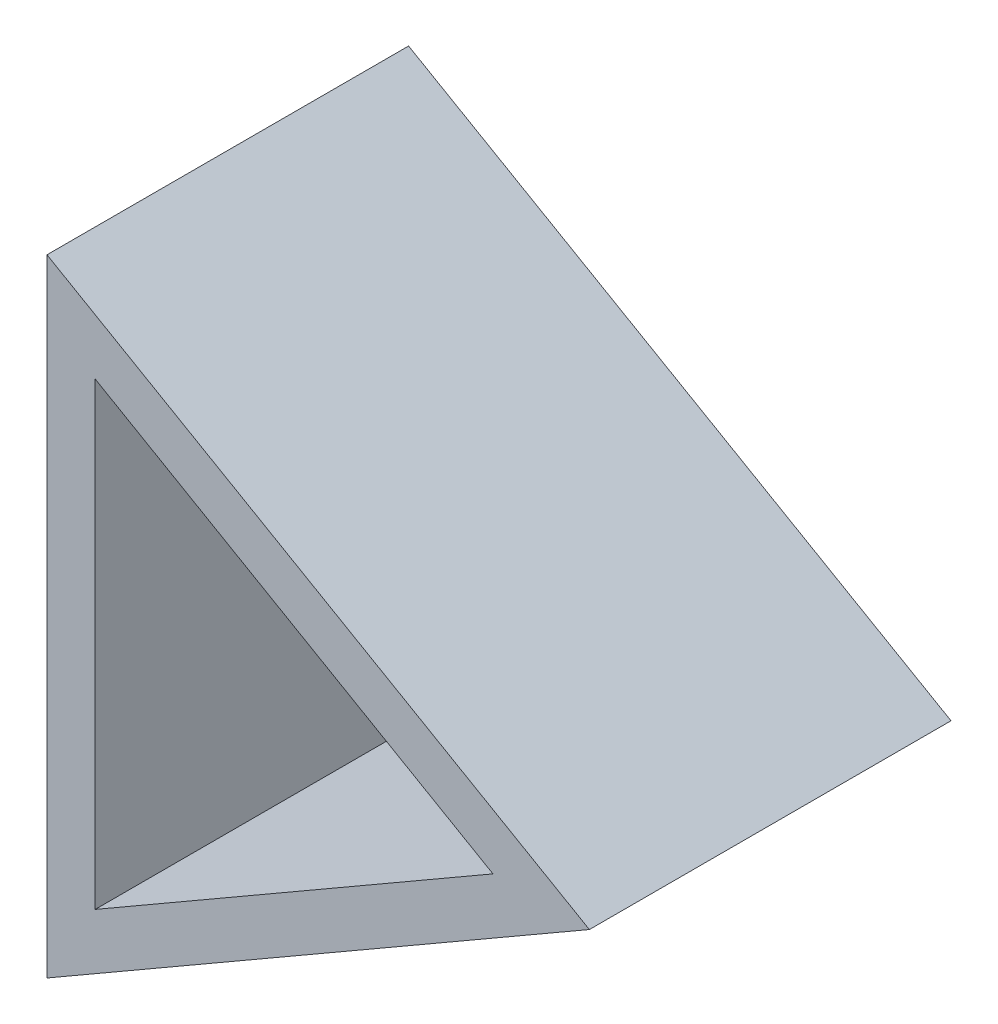
ISO-10303-21;
HEADER;
FILE_DESCRIPTION(('STEP AP214'),'2;1');
FILE_NAME('part.step','',(''),(''),'','','');
FILE_SCHEMA(('AUTOMOTIVE_DESIGN { 1 0 10303 214 1 1 1 1 }'));
ENDSEC;
DATA;
#1=APPLICATION_CONTEXT('core data for automotive mechanical design processes');
#2=APPLICATION_PROTOCOL_DEFINITION('international standard','automotive_design',2000,#1);
#3=PRODUCT_CONTEXT('',#1,'mechanical');
#4=PRODUCT('Part','Part','',(#3));
#5=PRODUCT_RELATED_PRODUCT_CATEGORY('part','',(#4));
#6=PRODUCT_DEFINITION_FORMATION('','',#4);
#7=PRODUCT_DEFINITION_CONTEXT('part definition',#1,'design');
#8=PRODUCT_DEFINITION('design','',#6,#7);
#9=PRODUCT_DEFINITION_SHAPE('','',#8);
#10=(LENGTH_UNIT() NAMED_UNIT(*) SI_UNIT(.MILLI.,.METRE.));
#11=(NAMED_UNIT(*) PLANE_ANGLE_UNIT() SI_UNIT($,.RADIAN.));
#12=(NAMED_UNIT(*) SI_UNIT($,.STERADIAN.) SOLID_ANGLE_UNIT());
#13=UNCERTAINTY_MEASURE_WITH_UNIT(LENGTH_MEASURE(1.E-05),#10,'distance_accuracy_value','');
#14=(GEOMETRIC_REPRESENTATION_CONTEXT(3) GLOBAL_UNCERTAINTY_ASSIGNED_CONTEXT((#13)) GLOBAL_UNIT_ASSIGNED_CONTEXT((#10,
#11,#12)) REPRESENTATION_CONTEXT('',''));
#15=CARTESIAN_POINT('',(0.,0.,0.));
#16=DIRECTION('',(0.,0.,1.));
#17=DIRECTION('',(1.,0.,0.));
#18=AXIS2_PLACEMENT_3D('',#15,#16,#17);
#19=CARTESIAN_POINT('',(-15.,-25.9807621135332,15.));
#20=DIRECTION('',(-0.5,0.866025403784438,0.));
#21=DIRECTION('',(-0.866025403784439,-0.5,0.));
#22=AXIS2_PLACEMENT_3D('',#19,#20,#21);
#23=PLANE('',#22);
#24=DIRECTION('',(0.866025403784438,0.5,0.));
#25=VECTOR('',#24,1.);
#26=CARTESIAN_POINT('',(-15.,-25.9807621135332,-15.));
#27=LINE('',#26,#25);
#28=CARTESIAN_POINT('',(-15.,-25.9807621135332,-15.));
#29=VERTEX_POINT('',#28);
#30=CARTESIAN_POINT('',(30.,0.,-15.));
#31=VERTEX_POINT('',#30);
#32=EDGE_CURVE('E131',#29,#31,#27,.T.);
#33=ORIENTED_EDGE('',*,*,#32,.T.);
#34=DIRECTION('',(0.,0.,-1.));
#35=VECTOR('',#34,1.);
#36=CARTESIAN_POINT('',(30.,0.,15.));
#37=LINE('',#36,#35);
#38=CARTESIAN_POINT('',(30.,0.,15.));
#39=VERTEX_POINT('',#38);
#40=EDGE_CURVE('E11',#39,#31,#37,.T.);
#41=ORIENTED_EDGE('',*,*,#40,.F.);
#42=DIRECTION('',(0.866025403784438,0.5,0.));
#43=VECTOR('',#42,1.);
#44=CARTESIAN_POINT('',(-15.,-25.9807621135332,15.));
#45=LINE('',#44,#43);
#46=CARTESIAN_POINT('',(-15.,-25.9807621135332,15.));
#47=VERTEX_POINT('',#46);
#48=EDGE_CURVE('E126',#47,#39,#45,.T.);
#49=ORIENTED_EDGE('',*,*,#48,.F.);
#50=DIRECTION('',(0.,0.,-1.));
#51=VECTOR('',#50,1.);
#52=CARTESIAN_POINT('',(-15.,-25.9807621135332,15.));
#53=LINE('',#52,#51);
#54=EDGE_CURVE('E130',#47,#29,#53,.T.);
#55=ORIENTED_EDGE('',*,*,#54,.T.);
#56=EDGE_LOOP('',(#33,#41,#49,#55));
#57=FACE_BOUND('',#56,.T.);
#58=ADVANCED_FACE('F39',(#57),#23,.F.);
#59=CARTESIAN_POINT('',(30.,0.,15.));
#60=DIRECTION('',(-0.5,-0.866025403784439,0.));
#61=DIRECTION('',(0.866025403784439,-0.5,0.));
#62=AXIS2_PLACEMENT_3D('',#59,#60,#61);
#63=PLANE('',#62);
#64=DIRECTION('',(-0.866025403784439,0.5,0.));
#65=VECTOR('',#64,1.);
#66=CARTESIAN_POINT('',(30.,0.,-15.));
#67=LINE('',#66,#65);
#68=CARTESIAN_POINT('',(-15.,25.9807621135332,-15.));
#69=VERTEX_POINT('',#68);
#70=EDGE_CURVE('E134',#31,#69,#67,.T.);
#71=ORIENTED_EDGE('',*,*,#70,.T.);
#72=DIRECTION('',(0.,0.,-1.));
#73=VECTOR('',#72,1.);
#74=CARTESIAN_POINT('',(-15.,25.9807621135332,15.));
#75=LINE('',#74,#73);
#76=CARTESIAN_POINT('',(-15.,25.9807621135332,15.));
#77=VERTEX_POINT('',#76);
#78=EDGE_CURVE('E46',#77,#69,#75,.T.);
#79=ORIENTED_EDGE('',*,*,#78,.F.);
#80=DIRECTION('',(-0.866025403784439,0.5,0.));
#81=VECTOR('',#80,1.);
#82=CARTESIAN_POINT('',(30.,0.,15.));
#83=LINE('',#82,#81);
#84=EDGE_CURVE('E84',#39,#77,#83,.T.);
#85=ORIENTED_EDGE('',*,*,#84,.F.);
#86=ORIENTED_EDGE('',*,*,#40,.T.);
#87=EDGE_LOOP('',(#71,#79,#85,#86));
#88=FACE_BOUND('',#87,.T.);
#89=ADVANCED_FACE('F154',(#88),#63,.F.);
#90=CARTESIAN_POINT('',(-15.,25.9807621135332,15.));
#91=DIRECTION('',(1.,0.,0.));
#92=DIRECTION('',(0.,1.,0.));
#93=AXIS2_PLACEMENT_3D('',#90,#91,#92);
#94=PLANE('',#93);
#95=DIRECTION('',(0.,-1.,0.));
#96=VECTOR('',#95,1.);
#97=CARTESIAN_POINT('',(-15.,25.9807621135332,-15.));
#98=LINE('',#97,#96);
#99=EDGE_CURVE('E79',#69,#29,#98,.T.);
#100=ORIENTED_EDGE('',*,*,#99,.T.);
#101=ORIENTED_EDGE('',*,*,#54,.F.);
#102=DIRECTION('',(0.,-1.,0.));
#103=VECTOR('',#102,1.);
#104=CARTESIAN_POINT('',(-15.,25.9807621135332,15.));
#105=LINE('',#104,#103);
#106=EDGE_CURVE('E62',#77,#47,#105,.T.);
#107=ORIENTED_EDGE('',*,*,#106,.F.);
#108=ORIENTED_EDGE('',*,*,#78,.T.);
#109=EDGE_LOOP('',(#100,#101,#107,#108));
#110=FACE_BOUND('',#109,.T.);
#111=ADVANCED_FACE('F137',(#110),#94,.F.);
#112=CARTESIAN_POINT('',(0.,0.,15.));
#113=DIRECTION('',(0.,0.,1.));
#114=DIRECTION('',(1.,0.,0.));
#115=AXIS2_PLACEMENT_3D('',#112,#113,#114);
#116=PLANE('',#115);
#117=DIRECTION('',(0.866025403784439,0.5,0.));
#118=VECTOR('',#117,1.);
#119=CARTESIAN_POINT('',(-17.,-22.5166604983954,15.));
#120=LINE('',#119,#118);
#121=CARTESIAN_POINT('',(-11.,-19.0525588832577,15.));
#122=VERTEX_POINT('',#121);
#123=CARTESIAN_POINT('',(22.,0.,15.));
#124=VERTEX_POINT('',#123);
#125=EDGE_CURVE('E119',#122,#124,#120,.T.);
#126=ORIENTED_EDGE('',*,*,#125,.F.);
#127=DIRECTION('',(0.,-1.,0.));
#128=VECTOR('',#127,1.);
#129=CARTESIAN_POINT('',(-11.,25.9807621135332,15.));
#130=LINE('',#129,#128);
#131=CARTESIAN_POINT('',(-11.,19.0525588832576,15.));
#132=VERTEX_POINT('',#131);
#133=EDGE_CURVE('E124',#132,#122,#130,.T.);
#134=ORIENTED_EDGE('',*,*,#133,.F.);
#135=DIRECTION('',(-0.866025403784439,0.5,0.));
#136=VECTOR('',#135,1.);
#137=CARTESIAN_POINT('',(28.,-3.46410161513775,15.));
#138=LINE('',#137,#136);
#139=EDGE_CURVE('E112',#124,#132,#138,.T.);
#140=ORIENTED_EDGE('',*,*,#139,.F.);
#141=EDGE_LOOP('',(#126,#134,#140));
#142=FACE_BOUND('',#141,.T.);
#143=ORIENTED_EDGE('',*,*,#48,.T.);
#144=ORIENTED_EDGE('',*,*,#84,.T.);
#145=ORIENTED_EDGE('',*,*,#106,.T.);
#146=EDGE_LOOP('',(#143,#144,#145));
#147=FACE_BOUND('',#146,.T.);
#148=ADVANCED_FACE('F144',(#142,#147),#116,.T.);
#149=CARTESIAN_POINT('',(0.,0.,-15.));
#150=DIRECTION('',(0.,0.,1.));
#151=DIRECTION('',(1.,0.,0.));
#152=AXIS2_PLACEMENT_3D('',#149,#150,#151);
#153=PLANE('',#152);
#154=ORIENTED_EDGE('',*,*,#32,.F.);
#155=ORIENTED_EDGE('',*,*,#99,.F.);
#156=ORIENTED_EDGE('',*,*,#70,.F.);
#157=EDGE_LOOP('',(#154,#155,#156));
#158=FACE_BOUND('',#157,.T.);
#159=ADVANCED_FACE('F140',(#158),#153,.F.);
#160=CARTESIAN_POINT('',(-17.,-22.5166604983954,15.));
#161=DIRECTION('',(-0.5,0.866025403784438,0.));
#162=DIRECTION('',(-0.866025403784439,-0.5,0.));
#163=AXIS2_PLACEMENT_3D('',#160,#161,#162);
#164=PLANE('',#163);
#165=DIRECTION('',(0.866025403784439,0.5,0.));
#166=VECTOR('',#165,1.);
#167=CARTESIAN_POINT('',(-17.,-22.5166604983954,-11.));
#168=LINE('',#167,#166);
#169=CARTESIAN_POINT('',(-11.,-19.0525588832577,-11.));
#170=VERTEX_POINT('',#169);
#171=CARTESIAN_POINT('',(22.,0.,-11.));
#172=VERTEX_POINT('',#171);
#173=EDGE_CURVE('E105',#170,#172,#168,.T.);
#174=ORIENTED_EDGE('',*,*,#173,.F.);
#175=DIRECTION('',(0.,0.,-1.));
#176=VECTOR('',#175,1.);
#177=CARTESIAN_POINT('',(-11.,-19.0525588832577,15.));
#178=LINE('',#177,#176);
#179=EDGE_CURVE('E115',#122,#170,#178,.T.);
#180=ORIENTED_EDGE('',*,*,#179,.F.);
#181=ORIENTED_EDGE('',*,*,#125,.T.);
#182=DIRECTION('',(0.,0.,-1.));
#183=VECTOR('',#182,1.);
#184=CARTESIAN_POINT('',(22.,0.,15.));
#185=LINE('',#184,#183);
#186=EDGE_CURVE('E114',#124,#172,#185,.T.);
#187=ORIENTED_EDGE('',*,*,#186,.T.);
#188=EDGE_LOOP('',(#174,#180,#181,#187));
#189=FACE_BOUND('',#188,.T.);
#190=ADVANCED_FACE('F152',(#189),#164,.T.);
#191=CARTESIAN_POINT('',(28.,-3.46410161513775,15.));
#192=DIRECTION('',(-0.5,-0.866025403784439,0.));
#193=DIRECTION('',(0.866025403784439,-0.5,0.));
#194=AXIS2_PLACEMENT_3D('',#191,#192,#193);
#195=PLANE('',#194);
#196=DIRECTION('',(-0.866025403784439,0.5,0.));
#197=VECTOR('',#196,1.);
#198=CARTESIAN_POINT('',(28.,-3.46410161513775,-11.));
#199=LINE('',#198,#197);
#200=CARTESIAN_POINT('',(-11.,19.0525588832576,-11.));
#201=VERTEX_POINT('',#200);
#202=EDGE_CURVE('E100',#172,#201,#199,.T.);
#203=ORIENTED_EDGE('',*,*,#202,.F.);
#204=ORIENTED_EDGE('',*,*,#186,.F.);
#205=ORIENTED_EDGE('',*,*,#139,.T.);
#206=DIRECTION('',(0.,0.,-1.));
#207=VECTOR('',#206,1.);
#208=CARTESIAN_POINT('',(-11.,19.0525588832576,15.));
#209=LINE('',#208,#207);
#210=EDGE_CURVE('E53',#132,#201,#209,.T.);
#211=ORIENTED_EDGE('',*,*,#210,.T.);
#212=EDGE_LOOP('',(#203,#204,#205,#211));
#213=FACE_BOUND('',#212,.T.);
#214=ADVANCED_FACE('F110',(#213),#195,.T.);
#215=CARTESIAN_POINT('',(-11.,25.9807621135332,15.));
#216=DIRECTION('',(1.,0.,0.));
#217=DIRECTION('',(0.,1.,0.));
#218=AXIS2_PLACEMENT_3D('',#215,#216,#217);
#219=PLANE('',#218);
#220=DIRECTION('',(0.,-1.,0.));
#221=VECTOR('',#220,1.);
#222=CARTESIAN_POINT('',(-11.,25.9807621135332,-11.));
#223=LINE('',#222,#221);
#224=EDGE_CURVE('E102',#201,#170,#223,.T.);
#225=ORIENTED_EDGE('',*,*,#224,.F.);
#226=ORIENTED_EDGE('',*,*,#210,.F.);
#227=ORIENTED_EDGE('',*,*,#133,.T.);
#228=ORIENTED_EDGE('',*,*,#179,.T.);
#229=EDGE_LOOP('',(#225,#226,#227,#228));
#230=FACE_BOUND('',#229,.T.);
#231=ADVANCED_FACE('F117',(#230),#219,.T.);
#232=CARTESIAN_POINT('',(0.,0.,-11.));
#233=DIRECTION('',(0.,0.,1.));
#234=DIRECTION('',(1.,0.,0.));
#235=AXIS2_PLACEMENT_3D('',#232,#233,#234);
#236=PLANE('',#235);
#237=ORIENTED_EDGE('',*,*,#173,.T.);
#238=ORIENTED_EDGE('',*,*,#202,.T.);
#239=ORIENTED_EDGE('',*,*,#224,.T.);
#240=EDGE_LOOP('',(#237,#238,#239));
#241=FACE_BOUND('',#240,.T.);
#242=ADVANCED_FACE('F101',(#241),#236,.T.);
#243=CLOSED_SHELL('',(#58,#89,#111,#148,#159,#190,#214,#231,#242));
#244=MANIFOLD_SOLID_BREP('B2',#243);
#245=ADVANCED_BREP_SHAPE_REPRESENTATION('',(#18,#244),#14);
#246=SHAPE_DEFINITION_REPRESENTATION(#9,#245);
ENDSEC;
END-ISO-10303-21;
